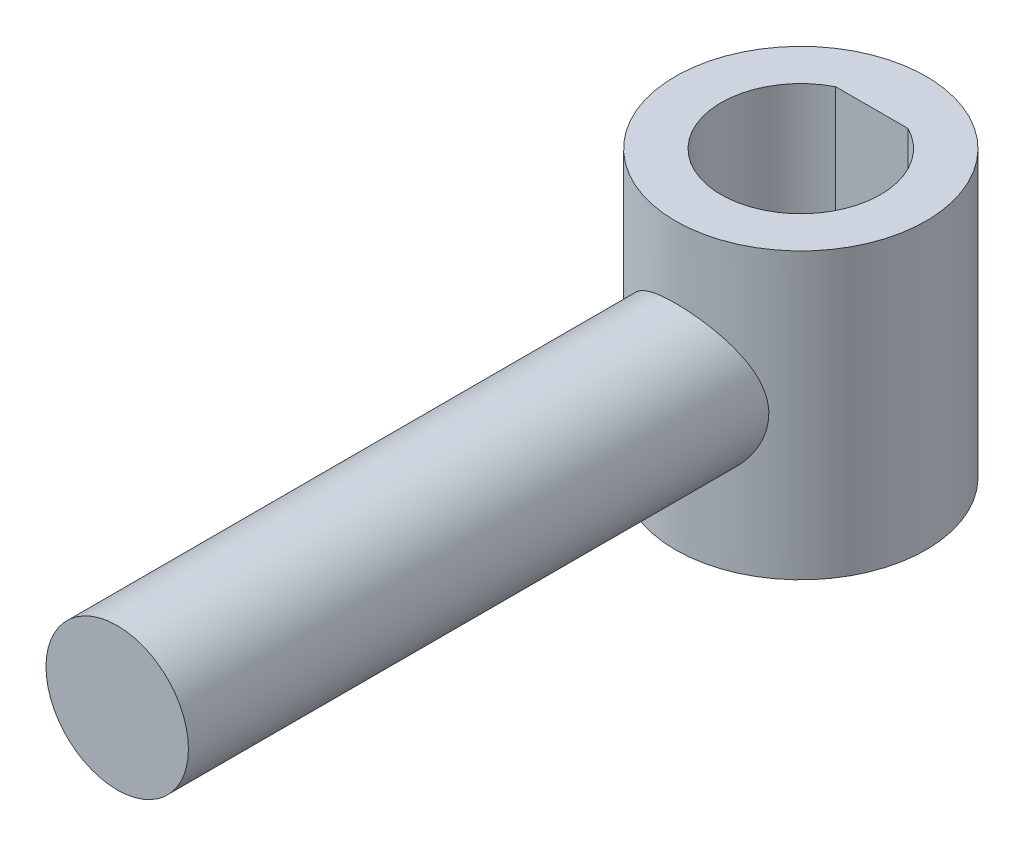
ISO-10303-21;
HEADER;
FILE_DESCRIPTION(('STEP AP214'),'2;1');
FILE_NAME('part.step','',(''),(''),'','','');
FILE_SCHEMA(('AUTOMOTIVE_DESIGN { 1 0 10303 214 1 1 1 1 }'));
ENDSEC;
DATA;
#1=APPLICATION_CONTEXT('core data for automotive mechanical design processes');
#2=APPLICATION_PROTOCOL_DEFINITION('international standard','automotive_design',2000,#1);
#3=PRODUCT_CONTEXT('',#1,'mechanical');
#4=PRODUCT('Part','Part','',(#3));
#5=PRODUCT_RELATED_PRODUCT_CATEGORY('part','',(#4));
#6=PRODUCT_DEFINITION_FORMATION('','',#4);
#7=PRODUCT_DEFINITION_CONTEXT('part definition',#1,'design');
#8=PRODUCT_DEFINITION('design','',#6,#7);
#9=PRODUCT_DEFINITION_SHAPE('','',#8);
#10=(LENGTH_UNIT() NAMED_UNIT(*) SI_UNIT(.MILLI.,.METRE.));
#11=(NAMED_UNIT(*) PLANE_ANGLE_UNIT() SI_UNIT($,.RADIAN.));
#12=(NAMED_UNIT(*) SI_UNIT($,.STERADIAN.) SOLID_ANGLE_UNIT());
#13=UNCERTAINTY_MEASURE_WITH_UNIT(LENGTH_MEASURE(1.E-05),#10,'distance_accuracy_value','');
#14=(GEOMETRIC_REPRESENTATION_CONTEXT(3) GLOBAL_UNCERTAINTY_ASSIGNED_CONTEXT((#13)) GLOBAL_UNIT_ASSIGNED_CONTEXT((#10,
#11,#12)) REPRESENTATION_CONTEXT('',''));
#15=CARTESIAN_POINT('',(0.,0.,0.));
#16=DIRECTION('',(0.,0.,1.));
#17=DIRECTION('',(1.,0.,0.));
#18=AXIS2_PLACEMENT_3D('',#15,#16,#17);
#19=CARTESIAN_POINT('',(0.,0.,60.));
#20=DIRECTION('',(0.,0.,-1.));
#21=DIRECTION('',(-1.,0.,0.));
#22=AXIS2_PLACEMENT_3D('',#19,#20,#21);
#23=CYLINDRICAL_SURFACE('',#22,6.25);
#24=DIRECTION('',(0.,0.,1.));
#25=VECTOR('',#24,1.);
#26=CARTESIAN_POINT('',(3.175,-5.38348168010257,51.65));
#27=LINE('',#26,#25);
#28=CARTESIAN_POINT('',(3.175,-5.38348168010257,51.65));
#29=VERTEX_POINT('',#28);
#30=CARTESIAN_POINT('',(3.175,-5.38348168010257,56.35));
#31=VERTEX_POINT('',#30);
#32=EDGE_CURVE('E88',#29,#31,#27,.T.);
#33=ORIENTED_EDGE('',*,*,#32,.F.);
#34=CARTESIAN_POINT('',(0.,0.,51.65));
#35=DIRECTION('',(0.,0.,1.));
#36=DIRECTION('',(-1.,0.,0.));
#37=AXIS2_PLACEMENT_3D('',#34,#35,#36);
#38=CIRCLE('',#37,6.25000000000001);
#39=CARTESIAN_POINT('',(-3.175,-5.38348168010257,51.65));
#40=VERTEX_POINT('',#39);
#41=EDGE_CURVE('E78',#40,#29,#38,.T.);
#42=ORIENTED_EDGE('',*,*,#41,.F.);
#43=DIRECTION('',(0.,0.,1.));
#44=VECTOR('',#43,1.);
#45=CARTESIAN_POINT('',(-3.175,-5.38348168010257,51.65));
#46=LINE('',#45,#44);
#47=CARTESIAN_POINT('',(-3.175,-5.38348168010257,56.35));
#48=VERTEX_POINT('',#47);
#49=EDGE_CURVE('E90',#40,#48,#46,.T.);
#50=ORIENTED_EDGE('',*,*,#49,.T.);
#51=CARTESIAN_POINT('',(0.,0.,56.35));
#52=DIRECTION('',(0.,0.,1.));
#53=DIRECTION('',(-1.,0.,0.));
#54=AXIS2_PLACEMENT_3D('',#51,#52,#53);
#55=CIRCLE('',#54,6.25000000000001);
#56=EDGE_CURVE('E93',#48,#31,#55,.T.);
#57=ORIENTED_EDGE('',*,*,#56,.T.);
#58=EDGE_LOOP('',(#33,#42,#50,#57));
#59=FACE_BOUND('',#58,.T.);
#60=CARTESIAN_POINT('',(0.,0.,60.));
#61=DIRECTION('',(0.,0.,1.));
#62=DIRECTION('',(1.,0.,0.));
#63=AXIS2_PLACEMENT_3D('',#60,#61,#62);
#64=CIRCLE('',#63,6.25);
#65=CARTESIAN_POINT('',(6.25,0.,60.));
#66=VERTEX_POINT('',#65);
#67=EDGE_CURVE('E45',#66,#66,#64,.T.);
#68=ORIENTED_EDGE('',*,*,#67,.F.);
#69=EDGE_LOOP('',(#68));
#70=FACE_BOUND('',#69,.T.);
#71=CARTESIAN_POINT('',(-6.25,0.,9.05193349511583));
#72=CARTESIAN_POINT('',(-6.24999937136487,0.159202588015522,9.05193437636768));
#73=CARTESIAN_POINT('',(-6.24390777915526,0.318414256748519,9.05614914268227));
#74=CARTESIAN_POINT('',(-6.21964253217894,0.635479677609584,9.07283079691288));
#75=CARTESIAN_POINT('',(-6.20146786973566,0.793333315371413,9.0852983730777));
#76=CARTESIAN_POINT('',(-6.15331116050535,1.10651802850995,9.1179825155062));
#77=CARTESIAN_POINT('',(-6.12332084739676,1.26184725840244,9.13820450655416));
#78=CARTESIAN_POINT('',(-6.05195075629456,1.56883488321008,9.18562591681666));
#79=CARTESIAN_POINT('',(-6.01056590458998,1.72049161004369,9.21282844392648));
#80=CARTESIAN_POINT('',(-5.91724560049291,2.01813298608509,9.27303948061461));
#81=CARTESIAN_POINT('',(-5.86538512178775,2.1641496179154,9.30600652030165));
#82=CARTESIAN_POINT('',(-5.75145466479171,2.45093796360931,9.37684747406609));
#83=CARTESIAN_POINT('',(-5.68938089853994,2.59170770762891,9.41472320759636));
#84=CARTESIAN_POINT('',(-5.48863558914412,3.00519896620541,9.53410247122233));
#85=CARTESIAN_POINT('',(-5.3353788468308,3.2692950920525,9.62139940885387));
#86=CARTESIAN_POINT('',(-4.97501995072822,3.79800756917889,9.8130053992736));
#87=CARTESIAN_POINT('',(-4.76388137018914,4.05957583362189,9.91813273686261));
#88=CARTESIAN_POINT('',(-4.41779038731103,4.42422497468481,10.0746842453231));
#89=CARTESIAN_POINT('',(-4.29744143355594,4.54122473550141,10.1267117283265));
#90=CARTESIAN_POINT('',(-4.0473056773403,4.76550377948603,10.2292504362945));
#91=CARTESIAN_POINT('',(-3.91751724901943,4.87278138092282,10.2797613979258));
#92=CARTESIAN_POINT('',(-3.63643881645987,5.08653579983963,10.3827149346089));
#93=CARTESIAN_POINT('',(-3.48427411264601,5.19199207052365,10.4348937156807));
#94=CARTESIAN_POINT('',(-3.17013906047401,5.38953831661112,10.5345789847284));
#95=CARTESIAN_POINT('',(-3.00817307417765,5.48163417696377,10.5820875268446));
#96=CARTESIAN_POINT('',(-2.67538553838118,5.65152177813994,10.6710807432229));
#97=CARTESIAN_POINT('',(-2.50456723695709,5.72931871852364,10.7125676060082));
#98=CARTESIAN_POINT('',(-2.15522690496327,5.86966048479674,10.7882769950795));
#99=CARTESIAN_POINT('',(-1.97670598719057,5.93220750521627,10.8225005664929));
#100=CARTESIAN_POINT('',(-1.62934678494944,6.03636210189361,10.8799564818857));
#101=CARTESIAN_POINT('',(-1.46102994572393,6.07932387191652,10.9038889684935));
#102=CARTESIAN_POINT('',(-1.12052009295117,6.15119530752668,10.9441223689036));
#103=CARTESIAN_POINT('',(-0.948327286833466,6.1801057232362,10.960423690089));
#104=CARTESIAN_POINT('',(-0.601672103216887,6.22342207789718,10.9849061534152));
#105=CARTESIAN_POINT('',(-0.4272113607928,6.23783793666288,10.9930928490055));
#106=CARTESIAN_POINT('',(-0.0775095769239689,6.2519681777791,11.0011167702721));
#107=CARTESIAN_POINT('',(0.0977313954671952,6.25168383627595,11.0009547207153));
#108=CARTESIAN_POINT('',(0.427778552495638,6.23728008673861,10.9927766112551));
#109=CARTESIAN_POINT('',(0.582677326115651,6.22471220890636,10.9856413453625));
#110=CARTESIAN_POINT('',(0.890740469322182,6.18814564095324,10.9649632021253));
#111=CARTESIAN_POINT('',(1.04390424945981,6.16414317862072,10.9514182102543));
#112=CARTESIAN_POINT('',(1.3473316216047,6.1050047548251,10.9182409323864));
#113=CARTESIAN_POINT('',(1.49759621916787,6.06987272997293,10.8986107988031));
#114=CARTESIAN_POINT('',(1.79438618994771,5.98885240266375,10.8536960173831));
#115=CARTESIAN_POINT('',(1.94091007975833,5.94295990433336,10.8284091639768));
#116=CARTESIAN_POINT('',(2.23059038731293,5.84044306696988,10.7724839982923));
#117=CARTESIAN_POINT('',(2.37370614573285,5.78372837864105,10.7418008168798));
#118=CARTESIAN_POINT('',(2.6545179687125,5.66035141262053,10.6758779153295));
#119=CARTESIAN_POINT('',(2.79221219769561,5.59368580181206,10.6406366689726));
#120=CARTESIAN_POINT('',(3.19613801711498,5.3795902140704,10.5291294266167));
#121=CARTESIAN_POINT('',(3.45339649036308,5.21799573377236,10.4470430797073));
#122=CARTESIAN_POINT('',(3.96717959366452,4.84114006255049,10.2637246573276));
#123=CARTESIAN_POINT('',(4.22037896821687,4.62189046522003,10.1613777496992));
#124=CARTESIAN_POINT('',(4.57119808633664,4.26550405911871,10.0060291378664));
#125=CARTESIAN_POINT('',(4.68339782478106,4.14199667391685,9.9538926517048));
#126=CARTESIAN_POINT('',(4.89772439843027,3.88620965995165,9.85020028225123));
#127=CARTESIAN_POINT('',(4.99984944163886,3.75392847755676,9.79864450368971));
#128=CARTESIAN_POINT('',(5.20297915053324,3.46774439021168,9.69244076550146));
#129=CARTESIAN_POINT('',(5.30289179988,3.31299327271382,9.63798538185473));
#130=CARTESIAN_POINT('',(5.48917512689041,2.99424791897256,9.53312025786017));
#131=CARTESIAN_POINT('',(5.57554731509802,2.83025471653464,9.48271006654633));
#132=CARTESIAN_POINT('',(5.73382391278642,2.4940407761401,9.38785225813354));
#133=CARTESIAN_POINT('',(5.80574746021051,2.32183130045731,9.34339678009438));
#134=CARTESIAN_POINT('',(5.93434131160055,1.97005821926902,9.26225600682963));
#135=CARTESIAN_POINT('',(5.99101687151063,1.79049717248538,9.22556803509503));
#136=CARTESIAN_POINT('',(6.07719437078896,1.46681830269753,9.16895437507506));
#137=CARTESIAN_POINT('',(6.1099438051923,1.32389229650203,9.1471141818611));
#138=CARTESIAN_POINT('',(6.16540703490337,1.0352943762448,9.10982317798701));
#139=CARTESIAN_POINT('',(6.18812276897522,0.889622998335081,9.09437113301242));
#140=CARTESIAN_POINT('',(6.22321015718636,0.596585267395382,9.0703973761916));
#141=CARTESIAN_POINT('',(6.2355898437192,0.449220320939454,9.06187028293825));
#142=CARTESIAN_POINT('',(6.24985945325785,0.153735608264368,9.05203475877796));
#143=CARTESIAN_POINT('',(6.25174910514193,0.00561582263493396,9.05072651444683));
#144=CARTESIAN_POINT('',(6.24500836283561,-0.290313536837577,9.05537888639009));
#145=CARTESIAN_POINT('',(6.23637476735561,-0.43812300257269,9.06134171460633));
#146=CARTESIAN_POINT('',(6.20870392380428,-0.732353984390247,9.08032348964157));
#147=CARTESIAN_POINT('',(6.18966288409851,-0.878774974833515,9.0933450080645));
#148=CARTESIAN_POINT('',(6.14142448206921,-1.1692202318008,9.12599318976872));
#149=CARTESIAN_POINT('',(6.1122247314326,-1.31324392636985,9.14562140624951));
#150=CARTESIAN_POINT('',(6.0440303603106,-1.59802077658234,9.19083032639962));
#151=CARTESIAN_POINT('',(6.00503174610613,-1.738772573083,9.21641345679724));
#152=CARTESIAN_POINT('',(5.87275784301935,-2.15869563707638,9.30171300728776));
#153=CARTESIAN_POINT('',(5.76483883258234,-2.43177041455224,9.36952568190572));
#154=CARTESIAN_POINT('',(5.5140153645526,-2.95687025130511,9.51929238690238));
#155=CARTESIAN_POINT('',(5.3710965179817,-3.20888659583461,9.60125222930149));
#156=CARTESIAN_POINT('',(5.02695733935957,-3.72888513663609,9.78640664149124));
#157=CARTESIAN_POINT('',(4.82001333200936,-3.99267111695351,9.89087621550948));
#158=CARTESIAN_POINT('',(4.48016227483484,-4.36103788632174,10.0470790982591));
#159=CARTESIAN_POINT('',(4.36187445431506,-4.47935206516524,10.0991013933047));
#160=CARTESIAN_POINT('',(4.11583099412636,-4.70642554604769,10.201847114634));
#161=CARTESIAN_POINT('',(3.98807382395237,-4.81518329727191,10.2525703291605));
#162=CARTESIAN_POINT('',(3.71076909557232,-5.03256188898251,10.3563599287216));
#163=CARTESIAN_POINT('',(3.56031043100297,-5.14014266514452,10.4091751168464));
#164=CARTESIAN_POINT('',(3.2494456484576,-5.34209097807508,10.5103665165018));
#165=CARTESIAN_POINT('',(3.08904384664066,-5.43646419088171,10.5587446317941));
#166=CARTESIAN_POINT('',(2.75920921833869,-5.61106657878248,10.6496955771954));
#167=CARTESIAN_POINT('',(2.58977964553422,-5.69130080537147,10.6922704794063));
#168=CARTESIAN_POINT('',(2.24299922445789,-5.83667596410491,10.7703539733136));
#169=CARTESIAN_POINT('',(2.06564947257437,-5.90181897764464,10.8058635393727));
#170=CARTESIAN_POINT('',(1.71927580041468,-6.01139140480246,10.8661129678957));
#171=CARTESIAN_POINT('',(1.55076270642783,-6.05708181638916,10.8914974284558));
#172=CARTESIAN_POINT('',(1.20956387701324,-6.13433307908434,10.9346473789501));
#173=CARTESIAN_POINT('',(1.03687834352,-6.16589461255344,10.9524132368265));
#174=CARTESIAN_POINT('',(0.688949091633093,-6.21439293222216,10.979789564666));
#175=CARTESIAN_POINT('',(0.513707296139558,-6.23134018765079,10.9894058726361));
#176=CARTESIAN_POINT('',(0.162165427951458,-6.2503742804178,11.000209768908));
#177=CARTESIAN_POINT('',(-0.0141345436316085,-6.25246251564309,11.0013981500807));
#178=CARTESIAN_POINT('',(-0.345900702205482,-6.24236763192405,10.9956648037014));
#179=CARTESIAN_POINT('',(-0.501434904449425,-6.2317955111664,10.9896585501829));
#180=CARTESIAN_POINT('',(-0.810951532266879,-6.19911925168512,10.9711620592701));
#181=CARTESIAN_POINT('',(-0.964933429041098,-6.17701131011205,10.9586696836952));
#182=CARTESIAN_POINT('',(-1.27015339916452,-6.12154091664766,10.9274991650763));
#183=CARTESIAN_POINT('',(-1.42139246058045,-6.08818260595049,10.9088232981851));
#184=CARTESIAN_POINT('',(-1.72026408721155,-6.01057741903072,10.8657029686043));
#185=CARTESIAN_POINT('',(-1.86789522128533,-5.96632629666213,10.8412562565243));
#186=CARTESIAN_POINT('',(-2.15906317213799,-5.86725330904282,10.7870494158601));
#187=CARTESIAN_POINT('',(-2.30258657650597,-5.81240054262926,10.7572737740188));
#188=CARTESIAN_POINT('',(-2.584359203875,-5.6927183595719,10.6930819563922));
#189=CARTESIAN_POINT('',(-2.72260663737751,-5.62788559480017,10.6586642237422));
#190=CARTESIAN_POINT('',(-3.12838396660647,-5.41923797100609,10.5494792164055));
#191=CARTESIAN_POINT('',(-3.38713955885255,-5.2612081668916,10.4687432505869));
#192=CARTESIAN_POINT('',(-3.90394162589378,-4.89217761859079,10.2879654668258));
#193=CARTESIAN_POINT('',(-4.15879120314305,-4.67726604755034,10.1867772369178));
#194=CARTESIAN_POINT('',(-4.51261211826605,-4.32740473305585,10.0325967868916));
#195=CARTESIAN_POINT('',(-4.62590091859426,-4.20607813446294,9.9807550062217));
#196=CARTESIAN_POINT('',(-4.8425922221083,-3.95465943267617,9.87743316987319));
#197=CARTESIAN_POINT('',(-4.94599295963134,-3.82456577103469,9.82595318031279));
#198=CARTESIAN_POINT('',(-5.15241413185688,-3.54241897597479,9.71943766118992));
#199=CARTESIAN_POINT('',(-5.25431622163632,-3.38948027881317,9.66457628531879));
#200=CARTESIAN_POINT('',(-5.44474648456296,-3.07426919115509,9.55858831392466));
#201=CARTESIAN_POINT('',(-5.53327601390403,-2.91199774945763,9.50746133994487));
#202=CARTESIAN_POINT('',(-5.6960526399803,-2.57910214429153,9.41084138593937));
#203=CARTESIAN_POINT('',(-5.77031842081496,-2.40848928012083,9.36534106378441));
#204=CARTESIAN_POINT('',(-5.90379644538546,-2.05973655468728,9.28177780448078));
#205=CARTESIAN_POINT('',(-5.96301405073075,-1.88159940075765,9.24371221948442));
#206=CARTESIAN_POINT('',(-6.05292559644653,-1.56358851281397,9.18499970470326));
#207=CARTESIAN_POINT('',(-6.08705320064065,-1.42504239056899,9.16237033057928));
#208=CARTESIAN_POINT('',(-6.14585899912806,-1.14514420131511,9.12302983236535));
#209=CARTESIAN_POINT('',(-6.17053918437226,-1.00379273211734,9.10631746138083));
#210=CARTESIAN_POINT('',(-6.21014548442027,-0.719183511955744,9.07935401727237));
#211=CARTESIAN_POINT('',(-6.22507627550658,-0.575926708577699,9.06909984656607));
#212=CARTESIAN_POINT('',(-6.24500210784115,-0.288448854994658,9.05539035656878));
#213=CARTESIAN_POINT('',(-6.25000056950635,-0.144228153901958,9.05193269675365));
#214=CARTESIAN_POINT('',(-6.25,0.,9.05193349511583));
#215=B_SPLINE_CURVE_WITH_KNOTS('',3,(#71,#72,#73,#74,#75,#76,#77,#78,#79,#80,#81,#82,#83,#84,
#85,#86,#87,#88,#89,#90,#91,#92,#93,#94,#95,#96,#97,#98,#99,#100,#101,#102,#103,#104,#105,#106,
#107,#108,#109,#110,#111,#112,#113,#114,#115,#116,#117,#118,#119,#120,#121,#122,#123,#124,#125,
#126,#127,#128,#129,#130,#131,#132,#133,#134,#135,#136,#137,#138,#139,#140,#141,#142,#143,#144,
#145,#146,#147,#148,#149,#150,#151,#152,#153,#154,#155,#156,#157,#158,#159,#160,#161,#162,#163,
#164,#165,#166,#167,#168,#169,#170,#171,#172,#173,#174,#175,#176,#177,#178,#179,#180,#181,#182,
#183,#184,#185,#186,#187,#188,#189,#190,#191,#192,#193,#194,#195,#196,#197,#198,#199,#200,#201,
#202,#203,#204,#205,#206,#207,#208,#209,#210,#211,#212,#213,#214),.UNSPECIFIED.,.T.,.F.,(4,2,2,
2,2,2,2,2,2,2,2,2,2,2,2,2,2,2,2,2,2,2,2,2,2,2,2,2,2,2,2,2,2,2,2,2,2,2,2,2,2,2,2,2,2,2,2,2,2,2,2,
2,2,2,2,2,2,2,2,2,2,2,2,2,2,2,2,2,2,2,2,4),(0.,0.477453543452048,0.954946909490839,
1.43277492851675,1.91081605779506,2.38554992639329,2.86046026547151,3.80966878389376,
4.86179161191623,5.38854063682824,5.91538060513386,6.49167736510657,7.067719503986,
7.64355175867353,8.21930109960981,8.74462233803109,9.26991552944371,9.79484897443561,
10.3197368492487,10.7858963479274,11.2522097368758,11.7183583710442,12.1846890755425,
12.6550982637472,13.1256653731797,14.0662100931917,15.1123536097449,15.6363924197977,
16.1605242737306,16.736056012467,17.3115235003938,17.8862236529776,18.4607254532741,
18.9050047624318,19.3491981880219,19.7930460979655,20.2369054793925,20.6808999215172,
21.1250562273781,21.5693170250354,22.0137591844407,22.9140477410514,23.8147070435036,
24.8635647946806,25.3887702669762,25.9140608126836,26.4903906071464,27.066471954437,
27.6423470635982,28.2181427001365,28.7466941292832,29.2752200290419,29.8033669934699,
30.331464270942,30.7989295610422,31.2665490512023,31.7339966009266,32.2016266565571,
32.6706408733158,33.13981278106,34.0775481896227,35.1182382854713,35.6395397028242,
36.1609340332694,36.7356021114811,37.310211869871,37.8840637347154,38.4577108506715,
38.8907037238408,39.3236052977066,39.7562990781496,40.1888438250938),.UNSPECIFIED.);
#216=CARTESIAN_POINT('',(-6.25,0.,9.05193349511583));
#217=VERTEX_POINT('',#216);
#218=EDGE_CURVE('E11',#217,#217,#215,.T.);
#219=ORIENTED_EDGE('',*,*,#218,.F.);
#220=EDGE_LOOP('',(#219));
#221=FACE_BOUND('',#220,.T.);
#222=ADVANCED_FACE('F34',(#59,#70,#221),#23,.T.);
#223=CARTESIAN_POINT('',(0.,0.,60.));
#224=DIRECTION('',(0.,0.,1.));
#225=DIRECTION('',(1.,0.,0.));
#226=AXIS2_PLACEMENT_3D('',#223,#224,#225);
#227=PLANE('',#226);
#228=ORIENTED_EDGE('',*,*,#67,.T.);
#229=EDGE_LOOP('',(#228));
#230=FACE_BOUND('',#229,.T.);
#231=ADVANCED_FACE('F120',(#230),#227,.T.);
#232=CARTESIAN_POINT('',(0.,12.5,0.));
#233=DIRECTION('',(0.,-1.,0.));
#234=DIRECTION('',(0.,0.,-1.));
#235=AXIS2_PLACEMENT_3D('',#232,#233,#234);
#236=CYLINDRICAL_SURFACE('',#235,11.);
#237=CARTESIAN_POINT('',(0.,-12.5,0.));
#238=DIRECTION('',(0.,1.,0.));
#239=DIRECTION('',(0.,0.,1.));
#240=AXIS2_PLACEMENT_3D('',#237,#238,#239);
#241=CIRCLE('',#240,11.);
#242=CARTESIAN_POINT('',(0.,-12.5,11.));
#243=VERTEX_POINT('',#242);
#244=EDGE_CURVE('E111',#243,#243,#241,.T.);
#245=ORIENTED_EDGE('',*,*,#244,.T.);
#246=EDGE_LOOP('',(#245));
#247=FACE_BOUND('',#246,.T.);
#248=CARTESIAN_POINT('',(0.,12.5,0.));
#249=DIRECTION('',(0.,1.,0.));
#250=DIRECTION('',(0.,0.,1.));
#251=AXIS2_PLACEMENT_3D('',#248,#249,#250);
#252=CIRCLE('',#251,11.);
#253=CARTESIAN_POINT('',(0.,12.5,11.));
#254=VERTEX_POINT('',#253);
#255=EDGE_CURVE('E113',#254,#254,#252,.T.);
#256=ORIENTED_EDGE('',*,*,#255,.F.);
#257=EDGE_LOOP('',(#256));
#258=FACE_BOUND('',#257,.T.);
#259=ORIENTED_EDGE('',*,*,#218,.T.);
#260=EDGE_LOOP('',(#259));
#261=FACE_BOUND('',#260,.T.);
#262=ADVANCED_FACE('F125',(#247,#258,#261),#236,.T.);
#263=CARTESIAN_POINT('',(0.,12.5,0.));
#264=DIRECTION('',(0.,1.,0.));
#265=DIRECTION('',(0.,0.,1.));
#266=AXIS2_PLACEMENT_3D('',#263,#264,#265);
#267=PLANE('',#266);
#268=CARTESIAN_POINT('',(0.,12.5,0.));
#269=DIRECTION('',(0.,1.,0.));
#270=DIRECTION('',(0.,0.,1.));
#271=AXIS2_PLACEMENT_3D('',#268,#269,#270);
#272=CIRCLE('',#271,7.);
#273=CARTESIAN_POINT('',(-3.175,12.5,-6.2385394925415));
#274=VERTEX_POINT('',#273);
#275=CARTESIAN_POINT('',(3.175,12.5,-6.2385394925415));
#276=VERTEX_POINT('',#275);
#277=EDGE_CURVE('E59',#274,#276,#272,.T.);
#278=ORIENTED_EDGE('',*,*,#277,.F.);
#279=DIRECTION('',(-1.,0.,0.));
#280=VECTOR('',#279,1.);
#281=CARTESIAN_POINT('',(3.175,12.5,-6.2385394925415));
#282=LINE('',#281,#280);
#283=EDGE_CURVE('E99',#276,#274,#282,.T.);
#284=ORIENTED_EDGE('',*,*,#283,.F.);
#285=EDGE_LOOP('',(#278,#284));
#286=FACE_BOUND('',#285,.T.);
#287=ORIENTED_EDGE('',*,*,#255,.T.);
#288=EDGE_LOOP('',(#287));
#289=FACE_BOUND('',#288,.T.);
#290=ADVANCED_FACE('F127',(#286,#289),#267,.T.);
#291=CARTESIAN_POINT('',(0.,-12.5,0.));
#292=DIRECTION('',(0.,1.,0.));
#293=DIRECTION('',(0.,0.,1.));
#294=AXIS2_PLACEMENT_3D('',#291,#292,#293);
#295=PLANE('',#294);
#296=DIRECTION('',(-1.,0.,0.));
#297=VECTOR('',#296,1.);
#298=CARTESIAN_POINT('',(3.175,-12.5,-6.2385394925415));
#299=LINE('',#298,#297);
#300=CARTESIAN_POINT('',(3.175,-12.5,-6.2385394925415));
#301=VERTEX_POINT('',#300);
#302=CARTESIAN_POINT('',(-3.175,-12.5,-6.2385394925415));
#303=VERTEX_POINT('',#302);
#304=EDGE_CURVE('E105',#301,#303,#299,.T.);
#305=ORIENTED_EDGE('',*,*,#304,.T.);
#306=CARTESIAN_POINT('',(0.,-12.5,0.));
#307=DIRECTION('',(0.,1.,0.));
#308=DIRECTION('',(0.,0.,1.));
#309=AXIS2_PLACEMENT_3D('',#306,#307,#308);
#310=CIRCLE('',#309,7.);
#311=EDGE_CURVE('E102',#303,#301,#310,.T.);
#312=ORIENTED_EDGE('',*,*,#311,.T.);
#313=EDGE_LOOP('',(#305,#312));
#314=FACE_BOUND('',#313,.T.);
#315=ORIENTED_EDGE('',*,*,#244,.F.);
#316=EDGE_LOOP('',(#315));
#317=FACE_BOUND('',#316,.T.);
#318=ADVANCED_FACE('F133',(#314,#317),#295,.F.);
#319=CARTESIAN_POINT('',(0.,-12.5,0.));
#320=DIRECTION('',(0.,1.,0.));
#321=DIRECTION('',(0.,0.,1.));
#322=AXIS2_PLACEMENT_3D('',#319,#320,#321);
#323=CYLINDRICAL_SURFACE('',#322,7.);
#324=DIRECTION('',(0.,1.,0.));
#325=VECTOR('',#324,1.);
#326=CARTESIAN_POINT('',(3.175,-12.5,-6.2385394925415));
#327=LINE('',#326,#325);
#328=EDGE_CURVE('E108',#301,#276,#327,.T.);
#329=ORIENTED_EDGE('',*,*,#328,.F.);
#330=ORIENTED_EDGE('',*,*,#311,.F.);
#331=DIRECTION('',(0.,1.,0.));
#332=VECTOR('',#331,1.);
#333=CARTESIAN_POINT('',(-3.175,-12.5,-6.2385394925415));
#334=LINE('',#333,#332);
#335=EDGE_CURVE('E109',#303,#274,#334,.T.);
#336=ORIENTED_EDGE('',*,*,#335,.T.);
#337=ORIENTED_EDGE('',*,*,#277,.T.);
#338=EDGE_LOOP('',(#329,#330,#336,#337));
#339=FACE_BOUND('',#338,.T.);
#340=ADVANCED_FACE('F140',(#339),#323,.F.);
#341=CARTESIAN_POINT('',(3.175,-12.5,-6.2385394925415));
#342=DIRECTION('',(0.,0.,-1.));
#343=DIRECTION('',(-1.,0.,0.));
#344=AXIS2_PLACEMENT_3D('',#341,#342,#343);
#345=PLANE('',#344);
#346=ORIENTED_EDGE('',*,*,#335,.F.);
#347=ORIENTED_EDGE('',*,*,#304,.F.);
#348=ORIENTED_EDGE('',*,*,#328,.T.);
#349=ORIENTED_EDGE('',*,*,#283,.T.);
#350=EDGE_LOOP('',(#346,#347,#348,#349));
#351=FACE_BOUND('',#350,.T.);
#352=ADVANCED_FACE('F145',(#351),#345,.F.);
#353=CARTESIAN_POINT('',(-3.175,-5.38348168010257,51.65));
#354=DIRECTION('',(0.,1.,0.));
#355=DIRECTION('',(0.,0.,1.));
#356=AXIS2_PLACEMENT_3D('',#353,#354,#355);
#357=PLANE('',#356);
#358=DIRECTION('',(-1.,0.,0.));
#359=VECTOR('',#358,1.);
#360=CARTESIAN_POINT('',(-3.175,-5.38348168010257,56.35));
#361=LINE('',#360,#359);
#362=EDGE_CURVE('E51',#31,#48,#361,.T.);
#363=ORIENTED_EDGE('',*,*,#362,.T.);
#364=ORIENTED_EDGE('',*,*,#49,.F.);
#365=DIRECTION('',(-1.,0.,0.));
#366=VECTOR('',#365,1.);
#367=CARTESIAN_POINT('',(-3.175,-5.38348168010257,51.65));
#368=LINE('',#367,#366);
#369=EDGE_CURVE('E81',#29,#40,#368,.T.);
#370=ORIENTED_EDGE('',*,*,#369,.F.);
#371=ORIENTED_EDGE('',*,*,#32,.T.);
#372=EDGE_LOOP('',(#363,#364,#370,#371));
#373=FACE_BOUND('',#372,.T.);
#374=ADVANCED_FACE('F87',(#373),#357,.F.);
#375=CARTESIAN_POINT('',(0.,0.,51.65));
#376=DIRECTION('',(0.,0.,-1.));
#377=DIRECTION('',(-1.,0.,0.));
#378=AXIS2_PLACEMENT_3D('',#375,#376,#377);
#379=PLANE('',#378);
#380=ORIENTED_EDGE('',*,*,#41,.T.);
#381=ORIENTED_EDGE('',*,*,#369,.T.);
#382=EDGE_LOOP('',(#380,#381));
#383=FACE_BOUND('',#382,.T.);
#384=ADVANCED_FACE('F80',(#383),#379,.F.);
#385=CARTESIAN_POINT('',(0.,0.,56.35));
#386=DIRECTION('',(0.,0.,-1.));
#387=DIRECTION('',(-1.,0.,0.));
#388=AXIS2_PLACEMENT_3D('',#385,#386,#387);
#389=PLANE('',#388);
#390=ORIENTED_EDGE('',*,*,#56,.F.);
#391=ORIENTED_EDGE('',*,*,#362,.F.);
#392=EDGE_LOOP('',(#390,#391));
#393=FACE_BOUND('',#392,.T.);
#394=ADVANCED_FACE('F151',(#393),#389,.T.);
#395=CLOSED_SHELL('',(#222,#231,#262,#290,#318,#340,#352,#374,#384,#394));
#396=MANIFOLD_SOLID_BREP('B2',#395);
#397=ADVANCED_BREP_SHAPE_REPRESENTATION('',(#18,#396),#14);
#398=SHAPE_DEFINITION_REPRESENTATION(#9,#397);
ENDSEC;
END-ISO-10303-21;
